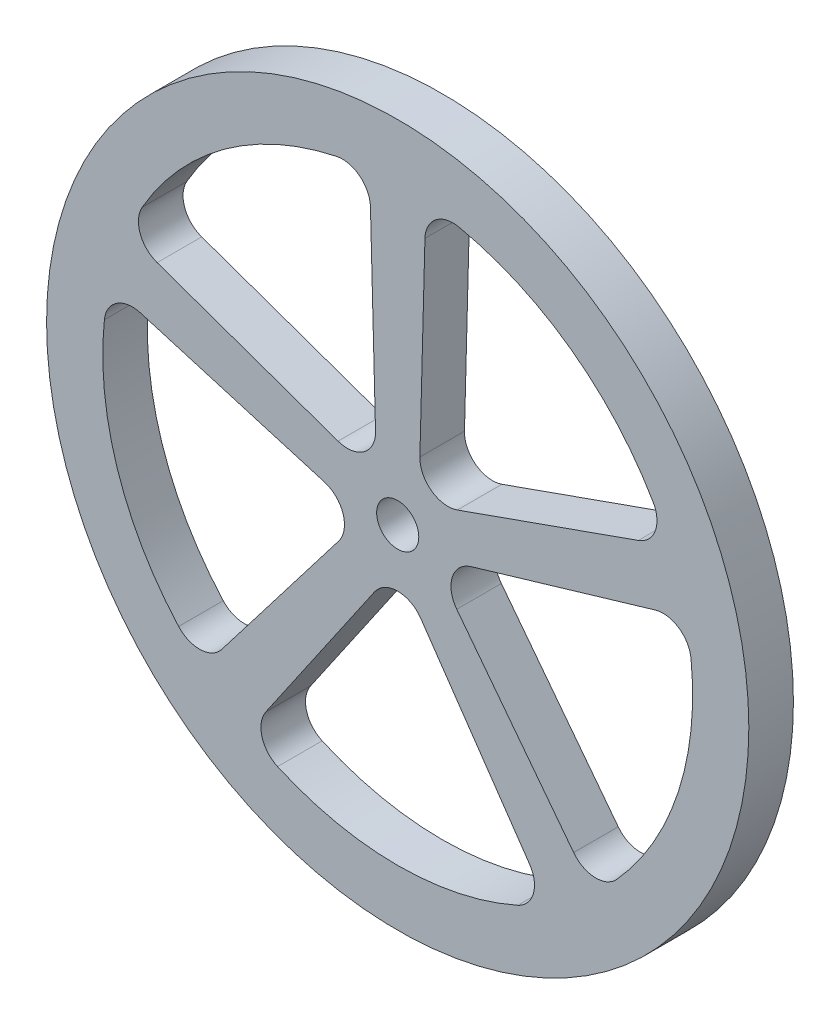
ISO-10303-21;
HEADER;
FILE_DESCRIPTION(('STEP AP214'),'2;1');
FILE_NAME('part.step','',(''),(''),'','','');
FILE_SCHEMA(('AUTOMOTIVE_DESIGN { 1 0 10303 214 1 1 1 1 }'));
ENDSEC;
DATA;
#1=APPLICATION_CONTEXT('core data for automotive mechanical design processes');
#2=APPLICATION_PROTOCOL_DEFINITION('international standard','automotive_design',2000,#1);
#3=PRODUCT_CONTEXT('',#1,'mechanical');
#4=PRODUCT('Part','Part','',(#3));
#5=PRODUCT_RELATED_PRODUCT_CATEGORY('part','',(#4));
#6=PRODUCT_DEFINITION_FORMATION('','',#4);
#7=PRODUCT_DEFINITION_CONTEXT('part definition',#1,'design');
#8=PRODUCT_DEFINITION('design','',#6,#7);
#9=PRODUCT_DEFINITION_SHAPE('','',#8);
#10=(LENGTH_UNIT() NAMED_UNIT(*) SI_UNIT(.MILLI.,.METRE.));
#11=(NAMED_UNIT(*) PLANE_ANGLE_UNIT() SI_UNIT($,.RADIAN.));
#12=(NAMED_UNIT(*) SI_UNIT($,.STERADIAN.) SOLID_ANGLE_UNIT());
#13=UNCERTAINTY_MEASURE_WITH_UNIT(LENGTH_MEASURE(1.E-05),#10,'distance_accuracy_value','');
#14=(GEOMETRIC_REPRESENTATION_CONTEXT(3) GLOBAL_UNCERTAINTY_ASSIGNED_CONTEXT((#13)) GLOBAL_UNIT_ASSIGNED_CONTEXT((#10,
#11,#12)) REPRESENTATION_CONTEXT('',''));
#15=CARTESIAN_POINT('',(0.,0.,0.));
#16=DIRECTION('',(0.,0.,1.));
#17=DIRECTION('',(1.,0.,0.));
#18=AXIS2_PLACEMENT_3D('',#15,#16,#17);
#19=CARTESIAN_POINT('',(0.,0.,3.175));
#20=DIRECTION('',(0.,0.,-1.));
#21=DIRECTION('',(-1.,0.,0.));
#22=AXIS2_PLACEMENT_3D('',#19,#20,#21);
#23=CYLINDRICAL_SURFACE('',#22,21.);
#24=CARTESIAN_POINT('',(0.,0.,3.175));
#25=DIRECTION('',(0.,0.,1.));
#26=DIRECTION('',(1.,0.,0.));
#27=AXIS2_PLACEMENT_3D('',#24,#25,#26);
#28=CIRCLE('',#27,21.);
#29=CARTESIAN_POINT('',(-4.35408102609381,20.5436602974789,3.175));
#30=VERTEX_POINT('',#29);
#31=CARTESIAN_POINT('',(-18.1926969625229,10.4893172909304,3.175));
#32=VERTEX_POINT('',#31);
#33=EDGE_CURVE('E281',#30,#32,#28,.T.);
#34=ORIENTED_EDGE('',*,*,#33,.T.);
#35=DIRECTION('',(0.,0.,-1.));
#36=VECTOR('',#35,1.);
#37=CARTESIAN_POINT('',(-18.1926969625229,10.4893172909304,3.175));
#38=LINE('',#37,#36);
#39=CARTESIAN_POINT('',(-18.1926969625229,10.4893172909304,0.));
#40=VERTEX_POINT('',#39);
#41=EDGE_CURVE('E339',#32,#40,#38,.T.);
#42=ORIENTED_EDGE('',*,*,#41,.T.);
#43=CARTESIAN_POINT('',(0.,0.,0.));
#44=DIRECTION('',(0.,0.,1.));
#45=DIRECTION('',(1.,0.,0.));
#46=AXIS2_PLACEMENT_3D('',#43,#44,#45);
#47=CIRCLE('',#46,21.);
#48=CARTESIAN_POINT('',(-4.35408102609381,20.5436602974789,0.));
#49=VERTEX_POINT('',#48);
#50=EDGE_CURVE('E437',#49,#40,#47,.T.);
#51=ORIENTED_EDGE('',*,*,#50,.F.);
#52=DIRECTION('',(0.,0.,-1.));
#53=VECTOR('',#52,1.);
#54=CARTESIAN_POINT('',(-4.35408102609381,20.5436602974789,3.175));
#55=LINE('',#54,#53);
#56=EDGE_CURVE('E337',#49,#30,#55,.F.);
#57=ORIENTED_EDGE('',*,*,#56,.T.);
#58=EDGE_LOOP('',(#34,#42,#51,#57));
#59=FACE_BOUND('',#58,.T.);
#60=ADVANCED_FACE('F51',(#59),#23,.F.);
#61=CARTESIAN_POINT('',(-20.8836670264198,2.2073630262432,0.));
#62=VERTEX_POINT('',#61);
#63=CARTESIAN_POINT('',(-15.5977860959598,-14.060905692902,0.));
#64=VERTEX_POINT('',#63);
#65=EDGE_CURVE('E435',#62,#64,#47,.T.);
#66=ORIENTED_EDGE('',*,*,#65,.F.);
#67=DIRECTION('',(0.,0.,-1.));
#68=VECTOR('',#67,1.);
#69=CARTESIAN_POINT('',(-20.8836670264198,2.2073630262432,3.175));
#70=LINE('',#69,#68);
#71=CARTESIAN_POINT('',(-20.8836670264198,2.2073630262432,3.175));
#72=VERTEX_POINT('',#71);
#73=EDGE_CURVE('E328',#62,#72,#70,.F.);
#74=ORIENTED_EDGE('',*,*,#73,.T.);
#75=CARTESIAN_POINT('',(-15.5977860959598,-14.060905692902,3.175));
#76=VERTEX_POINT('',#75);
#77=EDGE_CURVE('E442',#72,#76,#28,.T.);
#78=ORIENTED_EDGE('',*,*,#77,.T.);
#79=DIRECTION('',(0.,0.,-1.));
#80=VECTOR('',#79,1.);
#81=CARTESIAN_POINT('',(-15.5977860959598,-14.060905692902,3.175));
#82=LINE('',#81,#80);
#83=EDGE_CURVE('E325',#76,#64,#82,.T.);
#84=ORIENTED_EDGE('',*,*,#83,.T.);
#85=EDGE_LOOP('',(#66,#74,#78,#84));
#86=FACE_BOUND('',#85,.T.);
#87=ADVANCED_FACE('F562',(#86),#23,.F.);
#88=CARTESIAN_POINT('',(-8.55273500596898,-19.1794349217508,3.175));
#89=VERTEX_POINT('',#88);
#90=CARTESIAN_POINT('',(8.55273500596925,-19.1794349217506,3.175));
#91=VERTEX_POINT('',#90);
#92=EDGE_CURVE('E413',#89,#91,#28,.T.);
#93=ORIENTED_EDGE('',*,*,#92,.T.);
#94=DIRECTION('',(0.,0.,-1.));
#95=VECTOR('',#94,1.);
#96=CARTESIAN_POINT('',(8.55273500596926,-19.1794349217506,3.175));
#97=LINE('',#96,#95);
#98=CARTESIAN_POINT('',(8.55273500596925,-19.1794349217506,0.));
#99=VERTEX_POINT('',#98);
#100=EDGE_CURVE('E357',#91,#99,#97,.T.);
#101=ORIENTED_EDGE('',*,*,#100,.T.);
#102=CARTESIAN_POINT('',(-8.55273500596898,-19.1794349217508,0.));
#103=VERTEX_POINT('',#102);
#104=EDGE_CURVE('E431',#103,#99,#47,.T.);
#105=ORIENTED_EDGE('',*,*,#104,.F.);
#106=DIRECTION('',(0.,0.,-1.));
#107=VECTOR('',#106,1.);
#108=CARTESIAN_POINT('',(-8.55273500596898,-19.1794349217508,3.175));
#109=LINE('',#108,#107);
#110=EDGE_CURVE('E355',#103,#89,#109,.F.);
#111=ORIENTED_EDGE('',*,*,#110,.T.);
#112=EDGE_LOOP('',(#93,#101,#105,#111));
#113=FACE_BOUND('',#112,.T.);
#114=ADVANCED_FACE('F433',(#113),#23,.F.);
#115=CARTESIAN_POINT('',(15.59778609596,-14.0609056929017,3.175));
#116=VERTEX_POINT('',#115);
#117=CARTESIAN_POINT('',(20.8836670264198,2.20736302624349,3.175));
#118=VERTEX_POINT('',#117);
#119=EDGE_CURVE('E443',#116,#118,#28,.T.);
#120=ORIENTED_EDGE('',*,*,#119,.T.);
#121=DIRECTION('',(0.,0.,-1.));
#122=VECTOR('',#121,1.);
#123=CARTESIAN_POINT('',(20.8836670264198,2.20736302624349,3.175));
#124=LINE('',#123,#122);
#125=CARTESIAN_POINT('',(20.8836670264198,2.20736302624349,0.));
#126=VERTEX_POINT('',#125);
#127=EDGE_CURVE('E347',#118,#126,#124,.T.);
#128=ORIENTED_EDGE('',*,*,#127,.T.);
#129=CARTESIAN_POINT('',(15.59778609596,-14.0609056929017,0.));
#130=VERTEX_POINT('',#129);
#131=EDGE_CURVE('E436',#130,#126,#47,.T.);
#132=ORIENTED_EDGE('',*,*,#131,.F.);
#133=DIRECTION('',(0.,0.,-1.));
#134=VECTOR('',#133,1.);
#135=CARTESIAN_POINT('',(15.59778609596,-14.0609056929017,3.175));
#136=LINE('',#135,#134);
#137=EDGE_CURVE('E345',#130,#116,#136,.F.);
#138=ORIENTED_EDGE('',*,*,#137,.T.);
#139=EDGE_LOOP('',(#120,#128,#132,#138));
#140=FACE_BOUND('',#139,.T.);
#141=ADVANCED_FACE('F572',(#140),#23,.F.);
#142=CARTESIAN_POINT('',(-1.44609108062079,-0.0382471803381806,22.5914878389476));
#143=DIRECTION('',(-0.999650417424615,-0.0264394202431312,0.));
#144=DIRECTION('',(0.0264394202431312,-0.999650417424615,0.));
#145=AXIS2_PLACEMENT_3D('',#142,#143,#144);
#146=PLANE('',#145);
#147=DIRECTION('',(-0.0264394202431312,0.999650417424615,0.));
#148=VECTOR('',#147,1.);
#149=CARTESIAN_POINT('',(-1.44609108062079,-0.0382471803381806,3.175));
#150=LINE('',#149,#148);
#151=CARTESIAN_POINT('',(-1.57875487168952,4.9776500254049,3.175));
#152=VERTEX_POINT('',#151);
#153=CARTESIAN_POINT('',(-1.94010580780707,18.6400000620148,3.175));
#154=VERTEX_POINT('',#153);
#155=EDGE_CURVE('E271',#152,#154,#150,.T.);
#156=ORIENTED_EDGE('',*,*,#155,.T.);
#157=DIRECTION('',(0.,0.,1.));
#158=VECTOR('',#157,1.);
#159=CARTESIAN_POINT('',(-1.94010580780707,18.6400000620148,0.));
#160=LINE('',#159,#158);
#161=CARTESIAN_POINT('',(-1.94010580780707,18.6400000620148,0.));
#162=VERTEX_POINT('',#161);
#163=EDGE_CURVE('E270',#154,#162,#160,.F.);
#164=ORIENTED_EDGE('',*,*,#163,.T.);
#165=DIRECTION('',(-0.0264394202431312,0.999650417424615,0.));
#166=VECTOR('',#165,1.);
#167=CARTESIAN_POINT('',(-1.44609108062079,-0.0382471803381806,0.));
#168=LINE('',#167,#166);
#169=CARTESIAN_POINT('',(-1.57875487168952,4.9776500254049,0.));
#170=VERTEX_POINT('',#169);
#171=EDGE_CURVE('E253',#170,#162,#168,.T.);
#172=ORIENTED_EDGE('',*,*,#171,.F.);
#173=DIRECTION('',(0.,0.,1.));
#174=VECTOR('',#173,1.);
#175=CARTESIAN_POINT('',(-1.57875487168952,4.97765002540489,22.5914878389476));
#176=LINE('',#175,#174);
#177=EDGE_CURVE('E267',#170,#152,#176,.T.);
#178=ORIENTED_EDGE('',*,*,#177,.T.);
#179=EDGE_LOOP('',(#156,#164,#172,#178));
#180=FACE_BOUND('',#179,.T.);
#181=ADVANCED_FACE('F266',(#180),#146,.T.);
#182=CARTESIAN_POINT('',(18.1926969625227,10.4893172909307,3.175));
#183=VERTEX_POINT('',#182);
#184=CARTESIAN_POINT('',(4.35408102609381,20.5436602974789,3.175));
#185=VERTEX_POINT('',#184);
#186=EDGE_CURVE('E520',#183,#185,#28,.T.);
#187=ORIENTED_EDGE('',*,*,#186,.T.);
#188=DIRECTION('',(0.,0.,-1.));
#189=VECTOR('',#188,1.);
#190=CARTESIAN_POINT('',(4.35408102609381,20.5436602974789,3.175));
#191=LINE('',#190,#189);
#192=CARTESIAN_POINT('',(4.35408102609381,20.5436602974789,0.));
#193=VERTEX_POINT('',#192);
#194=EDGE_CURVE('E332',#185,#193,#191,.T.);
#195=ORIENTED_EDGE('',*,*,#194,.T.);
#196=CARTESIAN_POINT('',(18.1926969625227,10.4893172909307,0.));
#197=VERTEX_POINT('',#196);
#198=EDGE_CURVE('E438',#197,#193,#47,.T.);
#199=ORIENTED_EDGE('',*,*,#198,.F.);
#200=DIRECTION('',(0.,0.,-1.));
#201=VECTOR('',#200,1.);
#202=CARTESIAN_POINT('',(18.1926969625227,10.4893172909307,3.175));
#203=LINE('',#202,#201);
#204=EDGE_CURVE('E330',#197,#183,#203,.F.);
#205=ORIENTED_EDGE('',*,*,#204,.T.);
#206=EDGE_LOOP('',(#187,#195,#199,#205));
#207=FACE_BOUND('',#206,.T.);
#208=ADVANCED_FACE('F523',(#207),#23,.F.);
#209=CARTESIAN_POINT('',(0.,0.,3.175));
#210=DIRECTION('',(0.,0.,-1.));
#211=DIRECTION('',(-1.,0.,0.));
#212=AXIS2_PLACEMENT_3D('',#209,#210,#211);
#213=CYLINDRICAL_SURFACE('',#212,25.);
#214=CARTESIAN_POINT('',(0.,0.,3.175));
#215=DIRECTION('',(0.,0.,1.));
#216=DIRECTION('',(1.,0.,0.));
#217=AXIS2_PLACEMENT_3D('',#214,#215,#216);
#218=CIRCLE('',#217,25.);
#219=CARTESIAN_POINT('',(25.,0.,3.175));
#220=VERTEX_POINT('',#219);
#221=EDGE_CURVE('E276',#220,#220,#218,.T.);
#222=ORIENTED_EDGE('',*,*,#221,.F.);
#223=EDGE_LOOP('',(#222));
#224=FACE_BOUND('',#223,.T.);
#225=CARTESIAN_POINT('',(0.,0.,0.));
#226=DIRECTION('',(0.,0.,1.));
#227=DIRECTION('',(1.,0.,0.));
#228=AXIS2_PLACEMENT_3D('',#225,#226,#227);
#229=CIRCLE('',#228,25.);
#230=CARTESIAN_POINT('',(25.,0.,0.));
#231=VERTEX_POINT('',#230);
#232=EDGE_CURVE('E284',#231,#231,#229,.T.);
#233=ORIENTED_EDGE('',*,*,#232,.T.);
#234=EDGE_LOOP('',(#233));
#235=FACE_BOUND('',#234,.T.);
#236=ADVANCED_FACE('F571',(#224,#235),#213,.T.);
#237=CARTESIAN_POINT('',(0.,0.,3.175));
#238=DIRECTION('',(0.,0.,1.));
#239=DIRECTION('',(1.,0.,0.));
#240=AXIS2_PLACEMENT_3D('',#237,#238,#239);
#241=PLANE('',#240);
#242=ORIENTED_EDGE('',*,*,#77,.F.);
#243=CARTESIAN_POINT('',(-18.894746357237,1.9971379761248,3.175));
#244=DIRECTION('',(0.,0.,1.));
#245=DIRECTION('',(1.,0.,0.));
#246=AXIS2_PLACEMENT_3D('',#243,#244,#245);
#247=CIRCLE('',#246,2.);
#248=CARTESIAN_POINT('',(-18.3272191882191,3.9149265234956,3.175));
#249=VERTEX_POINT('',#248);
#250=EDGE_CURVE('E371',#72,#249,#247,.F.);
#251=ORIENTED_EDGE('',*,*,#250,.T.);
#252=DIRECTION('',(-0.9588942736854,0.283763584508917,0.));
#253=VECTOR('',#252,1.);
#254=CARTESIAN_POINT('',(-0.41049148923531,-1.38713337409212,3.175));
#255=LINE('',#254,#253);
#256=CARTESIAN_POINT('',(-5.22188857780236,0.0366933415479498,3.175));
#257=VERTEX_POINT('',#256);
#258=EDGE_CURVE('E461',#257,#249,#255,.T.);
#259=ORIENTED_EDGE('',*,*,#258,.F.);
#260=CARTESIAN_POINT('',(-5.7894157468202,-1.88109520582285,3.175));
#261=DIRECTION('',(0.,0.,1.));
#262=DIRECTION('',(1.,0.,0.));
#263=AXIS2_PLACEMENT_3D('',#260,#261,#262);
#264=CIRCLE('',#263,2.);
#265=CARTESIAN_POINT('',(-4.2030287971553,-3.09903463203948,3.175));
#266=VERTEX_POINT('',#265);
#267=EDGE_CURVE('E259',#257,#266,#264,.F.);
#268=ORIENTED_EDGE('',*,*,#267,.T.);
#269=DIRECTION('',(-0.608969713108313,-0.793193474832451,0.));
#270=VECTOR('',#269,1.);
#271=CARTESIAN_POINT('',(-1.1474311310917,0.880933629541091,3.175));
#272=LINE('',#271,#270);
#273=CARTESIAN_POINT('',(-12.5258957085845,-13.9397112436041,3.175));
#274=VERTEX_POINT('',#273);
#275=EDGE_CURVE('E467',#266,#274,#272,.T.);
#276=ORIENTED_EDGE('',*,*,#275,.T.);
#277=CARTESIAN_POINT('',(-14.1122826582494,-12.7217718173875,3.175));
#278=DIRECTION('',(0.,0.,1.));
#279=DIRECTION('',(1.,0.,0.));
#280=AXIS2_PLACEMENT_3D('',#277,#278,#279);
#281=CIRCLE('',#280,2.);
#282=EDGE_CURVE('E12',#274,#76,#281,.F.);
#283=ORIENTED_EDGE('',*,*,#282,.T.);
#284=EDGE_LOOP('',(#242,#251,#259,#268,#276,#283));
#285=FACE_BOUND('',#284,.T.);
#286=ORIENTED_EDGE('',*,*,#92,.F.);
#287=CARTESIAN_POINT('',(-7.73818881492431,-17.3528220720602,3.175));
#288=DIRECTION('',(0.,0.,1.));
#289=DIRECTION('',(1.,0.,0.));
#290=AXIS2_PLACEMENT_3D('',#287,#288,#289);
#291=CIRCLE('',#290,2.);
#292=CARTESIAN_POINT('',(-9.38673856978152,-16.220442407036,3.175));
#293=VERTEX_POINT('',#292);
#294=EDGE_CURVE('E403',#89,#293,#291,.F.);
#295=ORIENTED_EDGE('',*,*,#294,.T.);
#296=DIRECTION('',(-0.566189832512085,-0.824274877428603,0.));
#297=VECTOR('',#296,1.);
#298=CARTESIAN_POINT('',(1.19239338818081,-0.819048391780067,3.175));
#299=LINE('',#298,#297);
#300=CARTESIAN_POINT('',(-1.64854975485716,-4.95497229316745,3.175));
#301=VERTEX_POINT('',#300);
#302=EDGE_CURVE('E411',#301,#293,#299,.T.);
#303=ORIENTED_EDGE('',*,*,#302,.F.);
#304=CARTESIAN_POINT('',(0.,-6.08735195819162,3.175));
#305=DIRECTION('',(0.,0.,1.));
#306=DIRECTION('',(1.,0.,0.));
#307=AXIS2_PLACEMENT_3D('',#304,#305,#306);
#308=CIRCLE('',#307,2.);
#309=CARTESIAN_POINT('',(1.64854975485723,-4.95497229316743,3.175));
#310=VERTEX_POINT('',#309);
#311=EDGE_CURVE('E310',#301,#310,#308,.F.);
#312=ORIENTED_EDGE('',*,*,#311,.T.);
#313=DIRECTION('',(0.566189832512097,-0.824274877428594,0.));
#314=VECTOR('',#313,1.);
#315=CARTESIAN_POINT('',(-1.1923933881808,-0.819048391780085,3.175));
#316=LINE('',#315,#314);
#317=CARTESIAN_POINT('',(9.38673856978175,-16.2204424070359,3.175));
#318=VERTEX_POINT('',#317);
#319=EDGE_CURVE('E472',#310,#318,#316,.T.);
#320=ORIENTED_EDGE('',*,*,#319,.T.);
#321=CARTESIAN_POINT('',(7.73818881492456,-17.3528220720601,3.175));
#322=DIRECTION('',(0.,0.,1.));
#323=DIRECTION('',(1.,0.,0.));
#324=AXIS2_PLACEMENT_3D('',#321,#322,#323);
#325=CIRCLE('',#324,2.);
#326=EDGE_CURVE('E395',#318,#91,#325,.F.);
#327=ORIENTED_EDGE('',*,*,#326,.T.);
#328=EDGE_LOOP('',(#286,#295,#303,#312,#320,#327));
#329=FACE_BOUND('',#328,.T.);
#330=ORIENTED_EDGE('',*,*,#119,.F.);
#331=CARTESIAN_POINT('',(14.1122826582495,-12.7217718173873,3.175));
#332=DIRECTION('',(0.,0.,1.));
#333=DIRECTION('',(1.,0.,0.));
#334=AXIS2_PLACEMENT_3D('',#331,#332,#333);
#335=CIRCLE('',#334,2.);
#336=CARTESIAN_POINT('',(12.5258957085847,-13.939711243604,3.175));
#337=VERTEX_POINT('',#336);
#338=EDGE_CURVE('E399',#116,#337,#335,.F.);
#339=ORIENTED_EDGE('',*,*,#338,.T.);
#340=DIRECTION('',(0.608969713108325,-0.793193474832443,0.));
#341=VECTOR('',#340,1.);
#342=CARTESIAN_POINT('',(1.14743113109169,0.880933629541107,3.175));
#343=LINE('',#342,#341);
#344=CARTESIAN_POINT('',(4.20302879715534,-3.09903463203942,3.175));
#345=VERTEX_POINT('',#344);
#346=EDGE_CURVE('E477',#345,#337,#343,.T.);
#347=ORIENTED_EDGE('',*,*,#346,.F.);
#348=CARTESIAN_POINT('',(5.78941574682023,-1.88109520582277,3.175));
#349=DIRECTION('',(0.,0.,1.));
#350=DIRECTION('',(1.,0.,0.));
#351=AXIS2_PLACEMENT_3D('',#348,#349,#350);
#352=CIRCLE('',#351,2.);
#353=CARTESIAN_POINT('',(5.22188857780236,0.0366933415480244,3.175));
#354=VERTEX_POINT('',#353);
#355=EDGE_CURVE('E314',#345,#354,#352,.F.);
#356=ORIENTED_EDGE('',*,*,#355,.T.);
#357=DIRECTION('',(0.958894273685396,0.283763584508931,0.));
#358=VECTOR('',#357,1.);
#359=CARTESIAN_POINT('',(0.410491489235329,-1.38713337409212,3.175));
#360=LINE('',#359,#358);
#361=CARTESIAN_POINT('',(18.3272191882191,3.91492652349586,3.175));
#362=VERTEX_POINT('',#361);
#363=EDGE_CURVE('E484',#354,#362,#360,.T.);
#364=ORIENTED_EDGE('',*,*,#363,.T.);
#365=CARTESIAN_POINT('',(18.894746357237,1.99713797612507,3.175));
#366=DIRECTION('',(0.,0.,1.));
#367=DIRECTION('',(1.,0.,0.));
#368=AXIS2_PLACEMENT_3D('',#365,#366,#367);
#369=CIRCLE('',#368,2.);
#370=EDGE_CURVE('E387',#362,#118,#369,.F.);
#371=ORIENTED_EDGE('',*,*,#370,.T.);
#372=EDGE_LOOP('',(#330,#339,#347,#356,#364,#371));
#373=FACE_BOUND('',#372,.T.);
#374=ORIENTED_EDGE('',*,*,#186,.F.);
#375=CARTESIAN_POINT('',(16.4600591565682,9.49033469179442,3.175));
#376=DIRECTION('',(0.,0.,1.));
#377=DIRECTION('',(1.,0.,0.));
#378=AXIS2_PLACEMENT_3D('',#375,#376,#377);
#379=CIRCLE('',#378,2.);
#380=CARTESIAN_POINT('',(17.1281678572232,7.60522706512982,3.175));
#381=VERTEX_POINT('',#380);
#382=EDGE_CURVE('E391',#183,#381,#379,.F.);
#383=ORIENTED_EDGE('',*,*,#382,.T.);
#384=DIRECTION('',(0.942553813332298,0.334054350327523,0.));
#385=VECTOR('',#384,1.);
#386=CARTESIAN_POINT('',(-0.483241949416414,1.36349531666927,3.175));
#387=LINE('',#386,#385);
#388=CARTESIAN_POINT('',(4.2461644071938,3.03966355825411,3.175));
#389=VERTEX_POINT('',#388);
#390=EDGE_CURVE('E488',#389,#381,#387,.T.);
#391=ORIENTED_EDGE('',*,*,#390,.F.);
#392=CARTESIAN_POINT('',(3.57805570653875,4.92477118491871,3.175));
#393=DIRECTION('',(0.,0.,1.));
#394=DIRECTION('',(1.,0.,0.));
#395=AXIS2_PLACEMENT_3D('',#392,#393,#394);
#396=CIRCLE('',#395,2.);
#397=CARTESIAN_POINT('',(1.57875487168952,4.97765002540497,3.175));
#398=VERTEX_POINT('',#397);
#399=EDGE_CURVE('E320',#389,#398,#396,.F.);
#400=ORIENTED_EDGE('',*,*,#399,.T.);
#401=DIRECTION('',(0.0264394202431312,0.999650417424615,0.));
#402=VECTOR('',#401,1.);
#403=CARTESIAN_POINT('',(1.44609108062079,-0.0382471803381806,3.175));
#404=LINE('',#403,#402);
#405=CARTESIAN_POINT('',(1.94010580780707,18.6400000620148,3.175));
#406=VERTEX_POINT('',#405);
#407=EDGE_CURVE('E272',#398,#406,#404,.T.);
#408=ORIENTED_EDGE('',*,*,#407,.T.);
#409=CARTESIAN_POINT('',(3.9394066426563,18.5871212215285,3.175));
#410=DIRECTION('',(0.,0.,1.));
#411=DIRECTION('',(1.,0.,0.));
#412=AXIS2_PLACEMENT_3D('',#409,#410,#411);
#413=CIRCLE('',#412,2.);
#414=EDGE_CURVE('E375',#406,#185,#413,.F.);
#415=ORIENTED_EDGE('',*,*,#414,.T.);
#416=EDGE_LOOP('',(#374,#383,#391,#400,#408,#415));
#417=FACE_BOUND('',#416,.T.);
#418=ORIENTED_EDGE('',*,*,#155,.F.);
#419=CARTESIAN_POINT('',(-3.57805570653875,4.92477118491863,3.175));
#420=DIRECTION('',(0.,0.,1.));
#421=DIRECTION('',(1.,0.,0.));
#422=AXIS2_PLACEMENT_3D('',#419,#420,#421);
#423=CIRCLE('',#422,2.);
#424=CARTESIAN_POINT('',(-4.24616440719377,3.03966355825403,3.175));
#425=VERTEX_POINT('',#424);
#426=EDGE_CURVE('E260',#152,#425,#423,.F.);
#427=ORIENTED_EDGE('',*,*,#426,.T.);
#428=DIRECTION('',(-0.942553813332303,0.334054350327509,0.));
#429=VECTOR('',#428,1.);
#430=CARTESIAN_POINT('',(0.483241949416395,1.36349531666928,3.175));
#431=LINE('',#430,#429);
#432=CARTESIAN_POINT('',(-17.1281678572233,7.60522706512958,3.175));
#433=VERTEX_POINT('',#432);
#434=EDGE_CURVE('E457',#425,#433,#431,.T.);
#435=ORIENTED_EDGE('',*,*,#434,.T.);
#436=CARTESIAN_POINT('',(-16.4600591565683,9.49033469179419,3.175));
#437=DIRECTION('',(0.,0.,1.));
#438=DIRECTION('',(1.,0.,0.));
#439=AXIS2_PLACEMENT_3D('',#436,#437,#438);
#440=CIRCLE('',#439,2.);
#441=EDGE_CURVE('E379',#433,#32,#440,.F.);
#442=ORIENTED_EDGE('',*,*,#441,.T.);
#443=ORIENTED_EDGE('',*,*,#33,.F.);
#444=CARTESIAN_POINT('',(-3.9394066426563,18.5871212215285,3.175));
#445=DIRECTION('',(0.,0.,1.));
#446=DIRECTION('',(1.,0.,0.));
#447=AXIS2_PLACEMENT_3D('',#444,#445,#446);
#448=CIRCLE('',#447,2.);
#449=EDGE_CURVE('E383',#30,#154,#448,.F.);
#450=ORIENTED_EDGE('',*,*,#449,.T.);
#451=EDGE_LOOP('',(#418,#427,#435,#442,#443,#450));
#452=FACE_BOUND('',#451,.T.);
#453=ORIENTED_EDGE('',*,*,#221,.T.);
#454=EDGE_LOOP('',(#453));
#455=FACE_BOUND('',#454,.T.);
#456=CARTESIAN_POINT('',(0.,0.,3.175));
#457=DIRECTION('',(0.,0.,1.));
#458=DIRECTION('',(1.,0.,0.));
#459=AXIS2_PLACEMENT_3D('',#456,#457,#458);
#460=CIRCLE('',#459,1.5);
#461=CARTESIAN_POINT('',(1.5,0.,3.175));
#462=VERTEX_POINT('',#461);
#463=EDGE_CURVE('E446',#462,#462,#460,.T.);
#464=ORIENTED_EDGE('',*,*,#463,.F.);
#465=EDGE_LOOP('',(#464));
#466=FACE_BOUND('',#465,.T.);
#467=ADVANCED_FACE('F409',(#285,#329,#373,#417,#452,#455,#466),#241,.T.);
#468=CARTESIAN_POINT('',(0.,0.,0.));
#469=DIRECTION('',(0.,0.,1.));
#470=DIRECTION('',(1.,0.,0.));
#471=AXIS2_PLACEMENT_3D('',#468,#469,#470);
#472=PLANE('',#471);
#473=DIRECTION('',(-0.608969713108313,-0.793193474832452,0.));
#474=VECTOR('',#473,1.);
#475=CARTESIAN_POINT('',(-1.1474311310917,0.880933629541091,0.));
#476=LINE('',#475,#474);
#477=CARTESIAN_POINT('',(-4.2030287971553,-3.09903463203948,0.));
#478=VERTEX_POINT('',#477);
#479=CARTESIAN_POINT('',(-12.5258957085845,-13.9397112436041,0.));
#480=VERTEX_POINT('',#479);
#481=EDGE_CURVE('E422',#478,#480,#476,.T.);
#482=ORIENTED_EDGE('',*,*,#481,.F.);
#483=CARTESIAN_POINT('',(-5.7894157468202,-1.88109520582285,0.));
#484=DIRECTION('',(0.,0.,1.));
#485=DIRECTION('',(1.,0.,0.));
#486=AXIS2_PLACEMENT_3D('',#483,#484,#485);
#487=CIRCLE('',#486,2.);
#488=CARTESIAN_POINT('',(-5.22188857780237,0.0366933415479509,0.));
#489=VERTEX_POINT('',#488);
#490=EDGE_CURVE('E308',#478,#489,#487,.T.);
#491=ORIENTED_EDGE('',*,*,#490,.T.);
#492=DIRECTION('',(-0.9588942736854,0.283763584508918,0.));
#493=VECTOR('',#492,1.);
#494=CARTESIAN_POINT('',(-0.41049148923531,-1.38713337409212,0.));
#495=LINE('',#494,#493);
#496=CARTESIAN_POINT('',(-18.3272191882192,3.9149265234956,0.));
#497=VERTEX_POINT('',#496);
#498=EDGE_CURVE('E460',#489,#497,#495,.T.);
#499=ORIENTED_EDGE('',*,*,#498,.T.);
#500=CARTESIAN_POINT('',(-18.894746357237,1.9971379761248,0.));
#501=DIRECTION('',(0.,0.,1.));
#502=DIRECTION('',(1.,0.,0.));
#503=AXIS2_PLACEMENT_3D('',#500,#501,#502);
#504=CIRCLE('',#503,2.);
#505=EDGE_CURVE('E369',#497,#62,#504,.T.);
#506=ORIENTED_EDGE('',*,*,#505,.T.);
#507=ORIENTED_EDGE('',*,*,#65,.T.);
#508=CARTESIAN_POINT('',(-14.1122826582494,-12.7217718173875,0.));
#509=DIRECTION('',(0.,0.,1.));
#510=DIRECTION('',(1.,0.,0.));
#511=AXIS2_PLACEMENT_3D('',#508,#509,#510);
#512=CIRCLE('',#511,2.);
#513=EDGE_CURVE('E59',#64,#480,#512,.T.);
#514=ORIENTED_EDGE('',*,*,#513,.T.);
#515=EDGE_LOOP('',(#482,#491,#499,#506,#507,#514));
#516=FACE_BOUND('',#515,.T.);
#517=DIRECTION('',(0.566189832512097,-0.824274877428594,0.));
#518=VECTOR('',#517,1.);
#519=CARTESIAN_POINT('',(-1.1923933881808,-0.819048391780085,0.));
#520=LINE('',#519,#518);
#521=CARTESIAN_POINT('',(1.64854975485723,-4.95497229316743,0.));
#522=VERTEX_POINT('',#521);
#523=CARTESIAN_POINT('',(9.38673856978176,-16.2204424070359,0.));
#524=VERTEX_POINT('',#523);
#525=EDGE_CURVE('E468',#522,#524,#520,.T.);
#526=ORIENTED_EDGE('',*,*,#525,.F.);
#527=CARTESIAN_POINT('',(0.,-6.08735195819162,0.));
#528=DIRECTION('',(0.,0.,1.));
#529=DIRECTION('',(1.,0.,0.));
#530=AXIS2_PLACEMENT_3D('',#527,#528,#529);
#531=CIRCLE('',#530,2.);
#532=CARTESIAN_POINT('',(-1.64854975485716,-4.95497229316746,0.));
#533=VERTEX_POINT('',#532);
#534=EDGE_CURVE('E312',#522,#533,#531,.T.);
#535=ORIENTED_EDGE('',*,*,#534,.T.);
#536=DIRECTION('',(-0.566189832512085,-0.824274877428603,0.));
#537=VECTOR('',#536,1.);
#538=CARTESIAN_POINT('',(1.19239338818081,-0.819048391780067,0.));
#539=LINE('',#538,#537);
#540=CARTESIAN_POINT('',(-9.38673856978152,-16.2204424070361,0.));
#541=VERTEX_POINT('',#540);
#542=EDGE_CURVE('E423',#533,#541,#539,.T.);
#543=ORIENTED_EDGE('',*,*,#542,.T.);
#544=CARTESIAN_POINT('',(-7.73818881492431,-17.3528220720602,0.));
#545=DIRECTION('',(0.,0.,1.));
#546=DIRECTION('',(1.,0.,0.));
#547=AXIS2_PLACEMENT_3D('',#544,#545,#546);
#548=CIRCLE('',#547,2.);
#549=EDGE_CURVE('E401',#541,#103,#548,.T.);
#550=ORIENTED_EDGE('',*,*,#549,.T.);
#551=ORIENTED_EDGE('',*,*,#104,.T.);
#552=CARTESIAN_POINT('',(7.73818881492456,-17.3528220720601,0.));
#553=DIRECTION('',(0.,0.,1.));
#554=DIRECTION('',(1.,0.,0.));
#555=AXIS2_PLACEMENT_3D('',#552,#553,#554);
#556=CIRCLE('',#555,2.);
#557=EDGE_CURVE('E393',#99,#524,#556,.T.);
#558=ORIENTED_EDGE('',*,*,#557,.T.);
#559=EDGE_LOOP('',(#526,#535,#543,#550,#551,#558));
#560=FACE_BOUND('',#559,.T.);
#561=DIRECTION('',(0.958894273685396,0.283763584508931,0.));
#562=VECTOR('',#561,1.);
#563=CARTESIAN_POINT('',(0.410491489235329,-1.38713337409212,0.));
#564=LINE('',#563,#562);
#565=CARTESIAN_POINT('',(5.22188857780237,0.0366933415480249,0.));
#566=VERTEX_POINT('',#565);
#567=CARTESIAN_POINT('',(18.3272191882191,3.91492652349586,0.));
#568=VERTEX_POINT('',#567);
#569=EDGE_CURVE('E476',#566,#568,#564,.T.);
#570=ORIENTED_EDGE('',*,*,#569,.F.);
#571=CARTESIAN_POINT('',(5.78941574682023,-1.88109520582277,0.));
#572=DIRECTION('',(0.,0.,1.));
#573=DIRECTION('',(1.,0.,0.));
#574=AXIS2_PLACEMENT_3D('',#571,#572,#573);
#575=CIRCLE('',#574,2.);
#576=CARTESIAN_POINT('',(4.20302879715534,-3.09903463203942,0.));
#577=VERTEX_POINT('',#576);
#578=EDGE_CURVE('E316',#566,#577,#575,.T.);
#579=ORIENTED_EDGE('',*,*,#578,.T.);
#580=DIRECTION('',(0.608969713108325,-0.793193474832443,0.));
#581=VECTOR('',#580,1.);
#582=CARTESIAN_POINT('',(1.14743113109169,0.880933629541107,0.));
#583=LINE('',#582,#581);
#584=CARTESIAN_POINT('',(12.5258957085847,-13.9397112436039,0.));
#585=VERTEX_POINT('',#584);
#586=EDGE_CURVE('E475',#577,#585,#583,.T.);
#587=ORIENTED_EDGE('',*,*,#586,.T.);
#588=CARTESIAN_POINT('',(14.1122826582495,-12.7217718173873,0.));
#589=DIRECTION('',(0.,0.,1.));
#590=DIRECTION('',(1.,0.,0.));
#591=AXIS2_PLACEMENT_3D('',#588,#589,#590);
#592=CIRCLE('',#591,2.);
#593=EDGE_CURVE('E397',#585,#130,#592,.T.);
#594=ORIENTED_EDGE('',*,*,#593,.T.);
#595=ORIENTED_EDGE('',*,*,#131,.T.);
#596=CARTESIAN_POINT('',(18.894746357237,1.99713797612507,0.));
#597=DIRECTION('',(0.,0.,1.));
#598=DIRECTION('',(1.,0.,0.));
#599=AXIS2_PLACEMENT_3D('',#596,#597,#598);
#600=CIRCLE('',#599,2.);
#601=EDGE_CURVE('E385',#126,#568,#600,.T.);
#602=ORIENTED_EDGE('',*,*,#601,.T.);
#603=EDGE_LOOP('',(#570,#579,#587,#594,#595,#602));
#604=FACE_BOUND('',#603,.T.);
#605=DIRECTION('',(0.0264394202431312,0.999650417424615,0.));
#606=VECTOR('',#605,1.);
#607=CARTESIAN_POINT('',(1.44609108062079,-0.0382471803381806,0.));
#608=LINE('',#607,#606);
#609=CARTESIAN_POINT('',(1.57875487168952,4.97765002540497,0.));
#610=VERTEX_POINT('',#609);
#611=CARTESIAN_POINT('',(1.94010580780707,18.6400000620148,0.));
#612=VERTEX_POINT('',#611);
#613=EDGE_CURVE('E448',#610,#612,#608,.T.);
#614=ORIENTED_EDGE('',*,*,#613,.F.);
#615=CARTESIAN_POINT('',(3.57805570653875,4.92477118491871,0.));
#616=DIRECTION('',(0.,0.,1.));
#617=DIRECTION('',(1.,0.,0.));
#618=AXIS2_PLACEMENT_3D('',#615,#616,#617);
#619=CIRCLE('',#618,2.);
#620=CARTESIAN_POINT('',(4.2461644071938,3.03966355825411,0.));
#621=VERTEX_POINT('',#620);
#622=EDGE_CURVE('E318',#610,#621,#619,.T.);
#623=ORIENTED_EDGE('',*,*,#622,.T.);
#624=DIRECTION('',(0.942553813332298,0.334054350327523,0.));
#625=VECTOR('',#624,1.);
#626=CARTESIAN_POINT('',(-0.483241949416414,1.36349531666927,0.));
#627=LINE('',#626,#625);
#628=CARTESIAN_POINT('',(17.1281678572232,7.60522706512982,0.));
#629=VERTEX_POINT('',#628);
#630=EDGE_CURVE('E487',#621,#629,#627,.T.);
#631=ORIENTED_EDGE('',*,*,#630,.T.);
#632=CARTESIAN_POINT('',(16.4600591565682,9.49033469179442,0.));
#633=DIRECTION('',(0.,0.,1.));
#634=DIRECTION('',(1.,0.,0.));
#635=AXIS2_PLACEMENT_3D('',#632,#633,#634);
#636=CIRCLE('',#635,2.);
#637=EDGE_CURVE('E389',#629,#197,#636,.T.);
#638=ORIENTED_EDGE('',*,*,#637,.T.);
#639=ORIENTED_EDGE('',*,*,#198,.T.);
#640=CARTESIAN_POINT('',(3.9394066426563,18.5871212215285,0.));
#641=DIRECTION('',(0.,0.,1.));
#642=DIRECTION('',(1.,0.,0.));
#643=AXIS2_PLACEMENT_3D('',#640,#641,#642);
#644=CIRCLE('',#643,2.);
#645=EDGE_CURVE('E373',#193,#612,#644,.T.);
#646=ORIENTED_EDGE('',*,*,#645,.T.);
#647=EDGE_LOOP('',(#614,#623,#631,#638,#639,#646));
#648=FACE_BOUND('',#647,.T.);
#649=ORIENTED_EDGE('',*,*,#171,.T.);
#650=CARTESIAN_POINT('',(-3.9394066426563,18.5871212215285,0.));
#651=DIRECTION('',(0.,0.,1.));
#652=DIRECTION('',(1.,0.,0.));
#653=AXIS2_PLACEMENT_3D('',#650,#651,#652);
#654=CIRCLE('',#653,2.);
#655=EDGE_CURVE('E381',#162,#49,#654,.T.);
#656=ORIENTED_EDGE('',*,*,#655,.T.);
#657=ORIENTED_EDGE('',*,*,#50,.T.);
#658=CARTESIAN_POINT('',(-16.4600591565683,9.49033469179419,0.));
#659=DIRECTION('',(0.,0.,1.));
#660=DIRECTION('',(1.,0.,0.));
#661=AXIS2_PLACEMENT_3D('',#658,#659,#660);
#662=CIRCLE('',#661,2.);
#663=CARTESIAN_POINT('',(-17.1281678572233,7.60522706512959,0.));
#664=VERTEX_POINT('',#663);
#665=EDGE_CURVE('E377',#40,#664,#662,.T.);
#666=ORIENTED_EDGE('',*,*,#665,.T.);
#667=DIRECTION('',(-0.942553813332303,0.33405435032751,0.));
#668=VECTOR('',#667,1.);
#669=CARTESIAN_POINT('',(0.483241949416395,1.36349531666928,0.));
#670=LINE('',#669,#668);
#671=CARTESIAN_POINT('',(-4.24616440719377,3.03966355825403,0.));
#672=VERTEX_POINT('',#671);
#673=EDGE_CURVE('E255',#672,#664,#670,.T.);
#674=ORIENTED_EDGE('',*,*,#673,.F.);
#675=CARTESIAN_POINT('',(-3.57805570653875,4.92477118491863,0.));
#676=DIRECTION('',(0.,0.,1.));
#677=DIRECTION('',(1.,0.,0.));
#678=AXIS2_PLACEMENT_3D('',#675,#676,#677);
#679=CIRCLE('',#678,2.);
#680=EDGE_CURVE('E249',#672,#170,#679,.T.);
#681=ORIENTED_EDGE('',*,*,#680,.T.);
#682=EDGE_LOOP('',(#649,#656,#657,#666,#674,#681));
#683=FACE_BOUND('',#682,.T.);
#684=ORIENTED_EDGE('',*,*,#232,.F.);
#685=EDGE_LOOP('',(#684));
#686=FACE_BOUND('',#685,.T.);
#687=CARTESIAN_POINT('',(0.,0.,0.));
#688=DIRECTION('',(0.,0.,1.));
#689=DIRECTION('',(1.,0.,0.));
#690=AXIS2_PLACEMENT_3D('',#687,#688,#689);
#691=CIRCLE('',#690,1.5);
#692=CARTESIAN_POINT('',(1.5,0.,0.));
#693=VERTEX_POINT('',#692);
#694=EDGE_CURVE('E451',#693,#693,#691,.T.);
#695=ORIENTED_EDGE('',*,*,#694,.T.);
#696=EDGE_LOOP('',(#695));
#697=FACE_BOUND('',#696,.T.);
#698=ADVANCED_FACE('F251',(#516,#560,#604,#648,#683,#686,#697),#472,.F.);
#699=CARTESIAN_POINT('',(1.44609108062079,-0.0382471803381806,22.5914878389476));
#700=DIRECTION('',(-0.999650417424615,0.0264394202431312,0.));
#701=DIRECTION('',(-0.0264394202431312,-0.999650417424615,0.));
#702=AXIS2_PLACEMENT_3D('',#699,#700,#701);
#703=PLANE('',#702);
#704=ORIENTED_EDGE('',*,*,#613,.T.);
#705=DIRECTION('',(0.,0.,-1.));
#706=VECTOR('',#705,1.);
#707=CARTESIAN_POINT('',(1.94010580780707,18.6400000620148,22.5914878389476));
#708=LINE('',#707,#706);
#709=EDGE_CURVE('E335',#612,#406,#708,.F.);
#710=ORIENTED_EDGE('',*,*,#709,.T.);
#711=ORIENTED_EDGE('',*,*,#407,.F.);
#712=DIRECTION('',(0.,0.,-1.));
#713=VECTOR('',#712,1.);
#714=CARTESIAN_POINT('',(1.57875487168952,4.97765002540497,22.5914878389476));
#715=LINE('',#714,#713);
#716=EDGE_CURVE('E301',#398,#610,#715,.T.);
#717=ORIENTED_EDGE('',*,*,#716,.T.);
#718=EDGE_LOOP('',(#704,#710,#711,#717));
#719=FACE_BOUND('',#718,.T.);
#720=ADVANCED_FACE('F514',(#719),#703,.F.);
#721=CARTESIAN_POINT('',(0.,0.,3.175));
#722=DIRECTION('',(0.,0.,-1.));
#723=DIRECTION('',(-1.,0.,0.));
#724=AXIS2_PLACEMENT_3D('',#721,#722,#723);
#725=CYLINDRICAL_SURFACE('',#724,1.5);
#726=ORIENTED_EDGE('',*,*,#463,.T.);
#727=EDGE_LOOP('',(#726));
#728=FACE_BOUND('',#727,.T.);
#729=ORIENTED_EDGE('',*,*,#694,.F.);
#730=EDGE_LOOP('',(#729));
#731=FACE_BOUND('',#730,.T.);
#732=ADVANCED_FACE('F617',(#728,#731),#725,.F.);
#733=CARTESIAN_POINT('',(-0.483241949416414,1.36349531666927,24.3271750480077));
#734=DIRECTION('',(-0.334054350327523,0.942553813332298,0.));
#735=DIRECTION('',(-0.942553813332298,-0.334054350327523,0.));
#736=AXIS2_PLACEMENT_3D('',#733,#734,#735);
#737=PLANE('',#736);
#738=ORIENTED_EDGE('',*,*,#390,.T.);
#739=DIRECTION('',(0.,0.,1.));
#740=VECTOR('',#739,1.);
#741=CARTESIAN_POINT('',(17.1281678572232,7.60522706512982,0.));
#742=LINE('',#741,#740);
#743=EDGE_CURVE('E352',#381,#629,#742,.F.);
#744=ORIENTED_EDGE('',*,*,#743,.T.);
#745=ORIENTED_EDGE('',*,*,#630,.F.);
#746=DIRECTION('',(0.,0.,-1.));
#747=VECTOR('',#746,1.);
#748=CARTESIAN_POINT('',(4.2461644071938,3.03966355825411,24.3271750480077));
#749=LINE('',#748,#747);
#750=EDGE_CURVE('E304',#621,#389,#749,.F.);
#751=ORIENTED_EDGE('',*,*,#750,.T.);
#752=EDGE_LOOP('',(#738,#744,#745,#751));
#753=FACE_BOUND('',#752,.T.);
#754=ADVANCED_FACE('F501',(#753),#737,.T.);
#755=CARTESIAN_POINT('',(-0.41049148923531,-1.38713337409212,24.3271750480077));
#756=DIRECTION('',(-0.283763584508917,-0.9588942736854,0.));
#757=DIRECTION('',(0.9588942736854,-0.283763584508917,0.));
#758=AXIS2_PLACEMENT_3D('',#755,#756,#757);
#759=PLANE('',#758);
#760=ORIENTED_EDGE('',*,*,#258,.T.);
#761=DIRECTION('',(0.,0.,1.));
#762=VECTOR('',#761,1.);
#763=CARTESIAN_POINT('',(-18.3272191882191,3.9149265234956,0.));
#764=LINE('',#763,#762);
#765=EDGE_CURVE('E322',#249,#497,#764,.F.);
#766=ORIENTED_EDGE('',*,*,#765,.T.);
#767=ORIENTED_EDGE('',*,*,#498,.F.);
#768=DIRECTION('',(0.,0.,1.));
#769=VECTOR('',#768,1.);
#770=CARTESIAN_POINT('',(-5.22188857780236,0.0366933415479498,24.3271750480077));
#771=LINE('',#770,#769);
#772=EDGE_CURVE('E278',#489,#257,#771,.T.);
#773=ORIENTED_EDGE('',*,*,#772,.T.);
#774=EDGE_LOOP('',(#760,#766,#767,#773));
#775=FACE_BOUND('',#774,.T.);
#776=ADVANCED_FACE('F621',(#775),#759,.T.);
#777=CARTESIAN_POINT('',(0.483241949416395,1.36349531666928,24.3271750480077));
#778=DIRECTION('',(-0.334054350327509,-0.942553813332303,0.));
#779=DIRECTION('',(0.942553813332303,-0.334054350327509,0.));
#780=AXIS2_PLACEMENT_3D('',#777,#778,#779);
#781=PLANE('',#780);
#782=ORIENTED_EDGE('',*,*,#673,.T.);
#783=DIRECTION('',(0.,0.,-1.));
#784=VECTOR('',#783,1.);
#785=CARTESIAN_POINT('',(-17.1281678572233,7.60522706512958,24.3271750480077));
#786=LINE('',#785,#784);
#787=EDGE_CURVE('E342',#664,#433,#786,.F.);
#788=ORIENTED_EDGE('',*,*,#787,.T.);
#789=ORIENTED_EDGE('',*,*,#434,.F.);
#790=DIRECTION('',(0.,0.,1.));
#791=VECTOR('',#790,1.);
#792=CARTESIAN_POINT('',(-4.24616440719377,3.03966355825403,24.3271750480077));
#793=LINE('',#792,#791);
#794=EDGE_CURVE('E275',#425,#672,#793,.F.);
#795=ORIENTED_EDGE('',*,*,#794,.T.);
#796=EDGE_LOOP('',(#782,#788,#789,#795));
#797=FACE_BOUND('',#796,.T.);
#798=ADVANCED_FACE('F541',(#797),#781,.F.);
#799=CARTESIAN_POINT('',(1.19239338818081,-0.819048391780067,25.4345340217084));
#800=DIRECTION('',(0.824274877428603,-0.566189832512085,0.));
#801=DIRECTION('',(0.566189832512085,0.824274877428603,0.));
#802=AXIS2_PLACEMENT_3D('',#799,#800,#801);
#803=PLANE('',#802);
#804=ORIENTED_EDGE('',*,*,#302,.T.);
#805=DIRECTION('',(0.,0.,1.));
#806=VECTOR('',#805,1.);
#807=CARTESIAN_POINT('',(-9.38673856978152,-16.220442407036,0.));
#808=LINE('',#807,#806);
#809=EDGE_CURVE('E365',#293,#541,#808,.F.);
#810=ORIENTED_EDGE('',*,*,#809,.T.);
#811=ORIENTED_EDGE('',*,*,#542,.F.);
#812=DIRECTION('',(0.,0.,1.));
#813=VECTOR('',#812,1.);
#814=CARTESIAN_POINT('',(-1.64854975485716,-4.95497229316745,25.4345340217084));
#815=LINE('',#814,#813);
#816=EDGE_CURVE('E291',#533,#301,#815,.T.);
#817=ORIENTED_EDGE('',*,*,#816,.T.);
#818=EDGE_LOOP('',(#804,#810,#811,#817));
#819=FACE_BOUND('',#818,.T.);
#820=ADVANCED_FACE('F418',(#819),#803,.T.);
#821=CARTESIAN_POINT('',(-1.1474311310917,0.880933629541091,25.4345340217084));
#822=DIRECTION('',(0.793193474832451,-0.608969713108313,0.));
#823=DIRECTION('',(0.608969713108313,0.793193474832451,0.));
#824=AXIS2_PLACEMENT_3D('',#821,#822,#823);
#825=PLANE('',#824);
#826=ORIENTED_EDGE('',*,*,#481,.T.);
#827=DIRECTION('',(0.,0.,-1.));
#828=VECTOR('',#827,1.);
#829=CARTESIAN_POINT('',(-12.5258957085845,-13.9397112436041,25.4345340217084));
#830=LINE('',#829,#828);
#831=EDGE_CURVE('E72',#480,#274,#830,.F.);
#832=ORIENTED_EDGE('',*,*,#831,.T.);
#833=ORIENTED_EDGE('',*,*,#275,.F.);
#834=DIRECTION('',(0.,0.,1.));
#835=VECTOR('',#834,1.);
#836=CARTESIAN_POINT('',(-4.2030287971553,-3.09903463203948,25.4345340217084));
#837=LINE('',#836,#835);
#838=EDGE_CURVE('E289',#266,#478,#837,.F.);
#839=ORIENTED_EDGE('',*,*,#838,.T.);
#840=EDGE_LOOP('',(#826,#832,#833,#839));
#841=FACE_BOUND('',#840,.T.);
#842=ADVANCED_FACE('F629',(#841),#825,.F.);
#843=CARTESIAN_POINT('',(1.14743113109169,0.880933629541107,25.4345340217084));
#844=DIRECTION('',(0.793193474832443,0.608969713108325,0.));
#845=DIRECTION('',(-0.608969713108325,0.793193474832443,0.));
#846=AXIS2_PLACEMENT_3D('',#843,#844,#845);
#847=PLANE('',#846);
#848=ORIENTED_EDGE('',*,*,#346,.T.);
#849=DIRECTION('',(0.,0.,1.));
#850=VECTOR('',#849,1.);
#851=CARTESIAN_POINT('',(12.5258957085847,-13.9397112436039,0.));
#852=LINE('',#851,#850);
#853=EDGE_CURVE('E362',#337,#585,#852,.F.);
#854=ORIENTED_EDGE('',*,*,#853,.T.);
#855=ORIENTED_EDGE('',*,*,#586,.F.);
#856=DIRECTION('',(0.,0.,1.));
#857=VECTOR('',#856,1.);
#858=CARTESIAN_POINT('',(4.20302879715534,-3.09903463203942,25.4345340217084));
#859=LINE('',#858,#857);
#860=EDGE_CURVE('E296',#577,#345,#859,.T.);
#861=ORIENTED_EDGE('',*,*,#860,.T.);
#862=EDGE_LOOP('',(#848,#854,#855,#861));
#863=FACE_BOUND('',#862,.T.);
#864=ADVANCED_FACE('F602',(#863),#847,.T.);
#865=CARTESIAN_POINT('',(-1.1923933881808,-0.819048391780085,25.4345340217084));
#866=DIRECTION('',(0.824274877428594,0.566189832512097,0.));
#867=DIRECTION('',(-0.566189832512097,0.824274877428594,0.));
#868=AXIS2_PLACEMENT_3D('',#865,#866,#867);
#869=PLANE('',#868);
#870=ORIENTED_EDGE('',*,*,#525,.T.);
#871=DIRECTION('',(0.,0.,-1.));
#872=VECTOR('',#871,1.);
#873=CARTESIAN_POINT('',(9.38673856978175,-16.2204424070359,25.4345340217084));
#874=LINE('',#873,#872);
#875=EDGE_CURVE('E360',#524,#318,#874,.F.);
#876=ORIENTED_EDGE('',*,*,#875,.T.);
#877=ORIENTED_EDGE('',*,*,#319,.F.);
#878=DIRECTION('',(0.,0.,1.));
#879=VECTOR('',#878,1.);
#880=CARTESIAN_POINT('',(1.64854975485723,-4.95497229316743,25.4345340217084));
#881=LINE('',#880,#879);
#882=EDGE_CURVE('E294',#310,#522,#881,.F.);
#883=ORIENTED_EDGE('',*,*,#882,.T.);
#884=EDGE_LOOP('',(#870,#876,#877,#883));
#885=FACE_BOUND('',#884,.T.);
#886=ADVANCED_FACE('F634',(#885),#869,.F.);
#887=CARTESIAN_POINT('',(0.410491489235329,-1.38713337409212,24.3271750480077));
#888=DIRECTION('',(-0.283763584508931,0.958894273685396,0.));
#889=DIRECTION('',(-0.958894273685396,-0.283763584508931,0.));
#890=AXIS2_PLACEMENT_3D('',#887,#888,#889);
#891=PLANE('',#890);
#892=ORIENTED_EDGE('',*,*,#569,.T.);
#893=DIRECTION('',(0.,0.,-1.));
#894=VECTOR('',#893,1.);
#895=CARTESIAN_POINT('',(18.3272191882191,3.91492652349586,24.3271750480077));
#896=LINE('',#895,#894);
#897=EDGE_CURVE('E350',#568,#362,#896,.F.);
#898=ORIENTED_EDGE('',*,*,#897,.T.);
#899=ORIENTED_EDGE('',*,*,#363,.F.);
#900=DIRECTION('',(0.,0.,1.));
#901=VECTOR('',#900,1.);
#902=CARTESIAN_POINT('',(5.22188857780236,0.0366933415480244,24.3271750480077));
#903=LINE('',#902,#901);
#904=EDGE_CURVE('E299',#354,#566,#903,.F.);
#905=ORIENTED_EDGE('',*,*,#904,.T.);
#906=EDGE_LOOP('',(#892,#898,#899,#905));
#907=FACE_BOUND('',#906,.T.);
#908=ADVANCED_FACE('F594',(#907),#891,.F.);
#909=CARTESIAN_POINT('',(-3.57805570653875,4.92477118491863,22.5914878389476));
#910=DIRECTION('',(0.,0.,1.));
#911=DIRECTION('',(1.,0.,0.));
#912=AXIS2_PLACEMENT_3D('',#909,#910,#911);
#913=CYLINDRICAL_SURFACE('',#912,2.);
#914=ORIENTED_EDGE('',*,*,#680,.F.);
#915=ORIENTED_EDGE('',*,*,#794,.F.);
#916=ORIENTED_EDGE('',*,*,#426,.F.);
#917=ORIENTED_EDGE('',*,*,#177,.F.);
#918=EDGE_LOOP('',(#914,#915,#916,#917));
#919=FACE_BOUND('',#918,.T.);
#920=ADVANCED_FACE('F274',(#919),#913,.F.);
#921=CARTESIAN_POINT('',(-5.7894157468202,-1.88109520582285,24.3271750480077));
#922=DIRECTION('',(0.,0.,1.));
#923=DIRECTION('',(1.,0.,0.));
#924=AXIS2_PLACEMENT_3D('',#921,#922,#923);
#925=CYLINDRICAL_SURFACE('',#924,2.);
#926=ORIENTED_EDGE('',*,*,#490,.F.);
#927=ORIENTED_EDGE('',*,*,#838,.F.);
#928=ORIENTED_EDGE('',*,*,#267,.F.);
#929=ORIENTED_EDGE('',*,*,#772,.F.);
#930=EDGE_LOOP('',(#926,#927,#928,#929));
#931=FACE_BOUND('',#930,.T.);
#932=ADVANCED_FACE('F644',(#931),#925,.F.);
#933=CARTESIAN_POINT('',(0.,-6.08735195819162,25.4345340217084));
#934=DIRECTION('',(0.,0.,1.));
#935=DIRECTION('',(1.,0.,0.));
#936=AXIS2_PLACEMENT_3D('',#933,#934,#935);
#937=CYLINDRICAL_SURFACE('',#936,2.);
#938=ORIENTED_EDGE('',*,*,#534,.F.);
#939=ORIENTED_EDGE('',*,*,#882,.F.);
#940=ORIENTED_EDGE('',*,*,#311,.F.);
#941=ORIENTED_EDGE('',*,*,#816,.F.);
#942=EDGE_LOOP('',(#938,#939,#940,#941));
#943=FACE_BOUND('',#942,.T.);
#944=ADVANCED_FACE('F648',(#943),#937,.F.);
#945=CARTESIAN_POINT('',(5.78941574682023,-1.88109520582277,25.4345340217084));
#946=DIRECTION('',(0.,0.,1.));
#947=DIRECTION('',(1.,0.,0.));
#948=AXIS2_PLACEMENT_3D('',#945,#946,#947);
#949=CYLINDRICAL_SURFACE('',#948,2.);
#950=ORIENTED_EDGE('',*,*,#578,.F.);
#951=ORIENTED_EDGE('',*,*,#904,.F.);
#952=ORIENTED_EDGE('',*,*,#355,.F.);
#953=ORIENTED_EDGE('',*,*,#860,.F.);
#954=EDGE_LOOP('',(#950,#951,#952,#953));
#955=FACE_BOUND('',#954,.T.);
#956=ADVANCED_FACE('F598',(#955),#949,.F.);
#957=CARTESIAN_POINT('',(3.57805570653875,4.92477118491871,22.5914878389476));
#958=DIRECTION('',(0.,0.,-1.));
#959=DIRECTION('',(-1.,0.,0.));
#960=AXIS2_PLACEMENT_3D('',#957,#958,#959);
#961=CYLINDRICAL_SURFACE('',#960,2.);
#962=ORIENTED_EDGE('',*,*,#399,.F.);
#963=ORIENTED_EDGE('',*,*,#750,.F.);
#964=ORIENTED_EDGE('',*,*,#622,.F.);
#965=ORIENTED_EDGE('',*,*,#716,.F.);
#966=EDGE_LOOP('',(#962,#963,#964,#965));
#967=FACE_BOUND('',#966,.T.);
#968=ADVANCED_FACE('F506',(#967),#961,.F.);
#969=CARTESIAN_POINT('',(-18.894746357237,1.9971379761248,3.175));
#970=DIRECTION('',(0.,0.,-1.));
#971=DIRECTION('',(-1.,0.,0.));
#972=AXIS2_PLACEMENT_3D('',#969,#970,#971);
#973=CYLINDRICAL_SURFACE('',#972,2.);
#974=ORIENTED_EDGE('',*,*,#250,.F.);
#975=ORIENTED_EDGE('',*,*,#73,.F.);
#976=ORIENTED_EDGE('',*,*,#505,.F.);
#977=ORIENTED_EDGE('',*,*,#765,.F.);
#978=EDGE_LOOP('',(#974,#975,#976,#977));
#979=FACE_BOUND('',#978,.T.);
#980=ADVANCED_FACE('F659',(#979),#973,.F.);
#981=CARTESIAN_POINT('',(3.9394066426563,18.5871212215285,3.175));
#982=DIRECTION('',(0.,0.,-1.));
#983=DIRECTION('',(-1.,0.,0.));
#984=AXIS2_PLACEMENT_3D('',#981,#982,#983);
#985=CYLINDRICAL_SURFACE('',#984,2.);
#986=ORIENTED_EDGE('',*,*,#414,.F.);
#987=ORIENTED_EDGE('',*,*,#709,.F.);
#988=ORIENTED_EDGE('',*,*,#645,.F.);
#989=ORIENTED_EDGE('',*,*,#194,.F.);
#990=EDGE_LOOP('',(#986,#987,#988,#989));
#991=FACE_BOUND('',#990,.T.);
#992=ADVANCED_FACE('F517',(#991),#985,.F.);
#993=CARTESIAN_POINT('',(-16.4600591565683,9.49033469179419,3.175));
#994=DIRECTION('',(0.,0.,-1.));
#995=DIRECTION('',(-1.,0.,0.));
#996=AXIS2_PLACEMENT_3D('',#993,#994,#995);
#997=CYLINDRICAL_SURFACE('',#996,2.);
#998=ORIENTED_EDGE('',*,*,#441,.F.);
#999=ORIENTED_EDGE('',*,*,#787,.F.);
#1000=ORIENTED_EDGE('',*,*,#665,.F.);
#1001=ORIENTED_EDGE('',*,*,#41,.F.);
#1002=EDGE_LOOP('',(#998,#999,#1000,#1001));
#1003=FACE_BOUND('',#1002,.T.);
#1004=ADVANCED_FACE('F538',(#1003),#997,.F.);
#1005=CARTESIAN_POINT('',(-3.9394066426563,18.5871212215285,3.175));
#1006=DIRECTION('',(0.,0.,-1.));
#1007=DIRECTION('',(-1.,0.,0.));
#1008=AXIS2_PLACEMENT_3D('',#1005,#1006,#1007);
#1009=CYLINDRICAL_SURFACE('',#1008,2.);
#1010=ORIENTED_EDGE('',*,*,#449,.F.);
#1011=ORIENTED_EDGE('',*,*,#56,.F.);
#1012=ORIENTED_EDGE('',*,*,#655,.F.);
#1013=ORIENTED_EDGE('',*,*,#163,.F.);
#1014=EDGE_LOOP('',(#1010,#1011,#1012,#1013));
#1015=FACE_BOUND('',#1014,.T.);
#1016=ADVANCED_FACE('F545',(#1015),#1009,.F.);
#1017=CARTESIAN_POINT('',(18.894746357237,1.99713797612507,3.175));
#1018=DIRECTION('',(0.,0.,-1.));
#1019=DIRECTION('',(-1.,0.,0.));
#1020=AXIS2_PLACEMENT_3D('',#1017,#1018,#1019);
#1021=CYLINDRICAL_SURFACE('',#1020,2.);
#1022=ORIENTED_EDGE('',*,*,#370,.F.);
#1023=ORIENTED_EDGE('',*,*,#897,.F.);
#1024=ORIENTED_EDGE('',*,*,#601,.F.);
#1025=ORIENTED_EDGE('',*,*,#127,.F.);
#1026=EDGE_LOOP('',(#1022,#1023,#1024,#1025));
#1027=FACE_BOUND('',#1026,.T.);
#1028=ADVANCED_FACE('F550',(#1027),#1021,.F.);
#1029=CARTESIAN_POINT('',(16.4600591565682,9.49033469179442,3.175));
#1030=DIRECTION('',(0.,0.,-1.));
#1031=DIRECTION('',(-1.,0.,0.));
#1032=AXIS2_PLACEMENT_3D('',#1029,#1030,#1031);
#1033=CYLINDRICAL_SURFACE('',#1032,2.);
#1034=ORIENTED_EDGE('',*,*,#382,.F.);
#1035=ORIENTED_EDGE('',*,*,#204,.F.);
#1036=ORIENTED_EDGE('',*,*,#637,.F.);
#1037=ORIENTED_EDGE('',*,*,#743,.F.);
#1038=EDGE_LOOP('',(#1034,#1035,#1036,#1037));
#1039=FACE_BOUND('',#1038,.T.);
#1040=ADVANCED_FACE('F547',(#1039),#1033,.F.);
#1041=CARTESIAN_POINT('',(7.73818881492456,-17.3528220720601,3.175));
#1042=DIRECTION('',(0.,0.,-1.));
#1043=DIRECTION('',(-1.,0.,0.));
#1044=AXIS2_PLACEMENT_3D('',#1041,#1042,#1043);
#1045=CYLINDRICAL_SURFACE('',#1044,2.);
#1046=ORIENTED_EDGE('',*,*,#326,.F.);
#1047=ORIENTED_EDGE('',*,*,#875,.F.);
#1048=ORIENTED_EDGE('',*,*,#557,.F.);
#1049=ORIENTED_EDGE('',*,*,#100,.F.);
#1050=EDGE_LOOP('',(#1046,#1047,#1048,#1049));
#1051=FACE_BOUND('',#1050,.T.);
#1052=ADVANCED_FACE('F549',(#1051),#1045,.F.);
#1053=CARTESIAN_POINT('',(14.1122826582495,-12.7217718173873,3.175));
#1054=DIRECTION('',(0.,0.,-1.));
#1055=DIRECTION('',(-1.,0.,0.));
#1056=AXIS2_PLACEMENT_3D('',#1053,#1054,#1055);
#1057=CYLINDRICAL_SURFACE('',#1056,2.);
#1058=ORIENTED_EDGE('',*,*,#338,.F.);
#1059=ORIENTED_EDGE('',*,*,#137,.F.);
#1060=ORIENTED_EDGE('',*,*,#593,.F.);
#1061=ORIENTED_EDGE('',*,*,#853,.F.);
#1062=EDGE_LOOP('',(#1058,#1059,#1060,#1061));
#1063=FACE_BOUND('',#1062,.T.);
#1064=ADVANCED_FACE('F556',(#1063),#1057,.F.);
#1065=CARTESIAN_POINT('',(-7.73818881492431,-17.3528220720602,3.175));
#1066=DIRECTION('',(0.,0.,-1.));
#1067=DIRECTION('',(-1.,0.,0.));
#1068=AXIS2_PLACEMENT_3D('',#1065,#1066,#1067);
#1069=CYLINDRICAL_SURFACE('',#1068,2.);
#1070=ORIENTED_EDGE('',*,*,#294,.F.);
#1071=ORIENTED_EDGE('',*,*,#110,.F.);
#1072=ORIENTED_EDGE('',*,*,#549,.F.);
#1073=ORIENTED_EDGE('',*,*,#809,.F.);
#1074=EDGE_LOOP('',(#1070,#1071,#1072,#1073));
#1075=FACE_BOUND('',#1074,.T.);
#1076=ADVANCED_FACE('F425',(#1075),#1069,.F.);
#1077=CARTESIAN_POINT('',(-14.1122826582494,-12.7217718173875,3.175));
#1078=DIRECTION('',(0.,0.,-1.));
#1079=DIRECTION('',(-1.,0.,0.));
#1080=AXIS2_PLACEMENT_3D('',#1077,#1078,#1079);
#1081=CYLINDRICAL_SURFACE('',#1080,2.);
#1082=ORIENTED_EDGE('',*,*,#282,.F.);
#1083=ORIENTED_EDGE('',*,*,#831,.F.);
#1084=ORIENTED_EDGE('',*,*,#513,.F.);
#1085=ORIENTED_EDGE('',*,*,#83,.F.);
#1086=EDGE_LOOP('',(#1082,#1083,#1084,#1085));
#1087=FACE_BOUND('',#1086,.T.);
#1088=ADVANCED_FACE('F53',(#1087),#1081,.F.);
#1089=CLOSED_SHELL('',(#60,#87,#114,#141,#181,#208,#236,#467,#698,#720,#732,#754,#776,#798,#820,
#842,#864,#886,#908,#920,#932,#944,#956,#968,#980,#992,#1004,#1016,#1028,#1040,#1052,#1064,
#1076,#1088));
#1090=MANIFOLD_SOLID_BREP('B2',#1089);
#1091=ADVANCED_BREP_SHAPE_REPRESENTATION('',(#18,#1090),#14);
#1092=SHAPE_DEFINITION_REPRESENTATION(#9,#1091);
ENDSEC;
END-ISO-10303-21;
